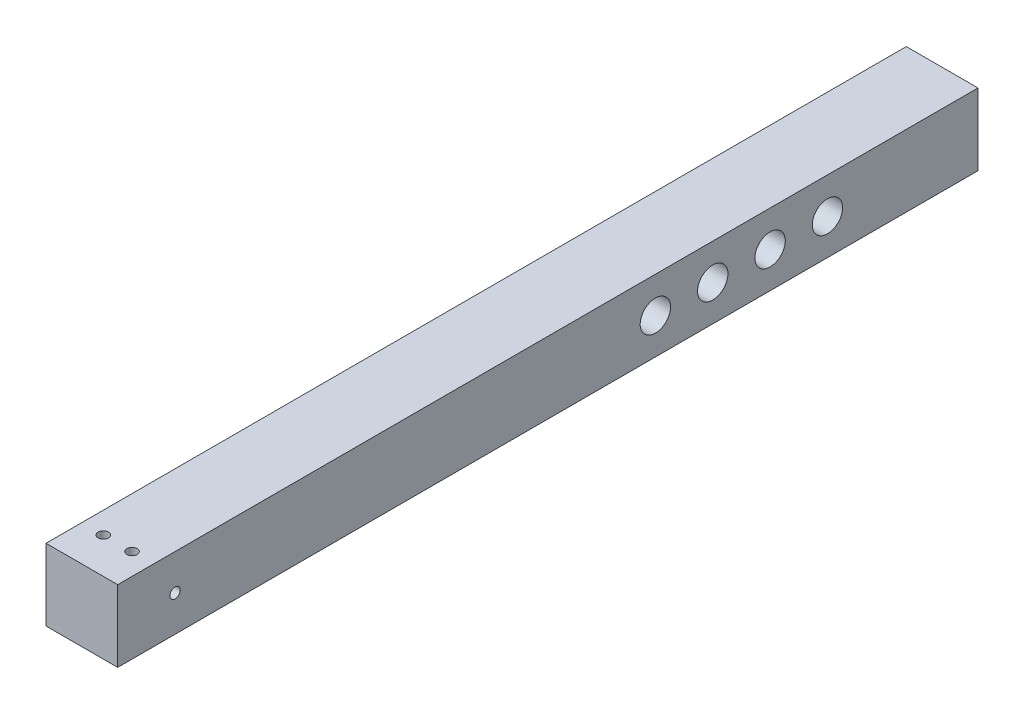
ISO-10303-21;
HEADER;
FILE_DESCRIPTION(('STEP AP214'),'2;1');
FILE_NAME('part.step','',(''),(''),'','','');
FILE_SCHEMA(('AUTOMOTIVE_DESIGN { 1 0 10303 214 1 1 1 1 }'));
ENDSEC;
DATA;
#1=APPLICATION_CONTEXT('core data for automotive mechanical design processes');
#2=APPLICATION_PROTOCOL_DEFINITION('international standard','automotive_design',2000,#1);
#3=PRODUCT_CONTEXT('',#1,'mechanical');
#4=PRODUCT('Part','Part','',(#3));
#5=PRODUCT_RELATED_PRODUCT_CATEGORY('part','',(#4));
#6=PRODUCT_DEFINITION_FORMATION('','',#4);
#7=PRODUCT_DEFINITION_CONTEXT('part definition',#1,'design');
#8=PRODUCT_DEFINITION('design','',#6,#7);
#9=PRODUCT_DEFINITION_SHAPE('','',#8);
#10=(LENGTH_UNIT() NAMED_UNIT(*) SI_UNIT(.MILLI.,.METRE.));
#11=(NAMED_UNIT(*) PLANE_ANGLE_UNIT() SI_UNIT($,.RADIAN.));
#12=(NAMED_UNIT(*) SI_UNIT($,.STERADIAN.) SOLID_ANGLE_UNIT());
#13=UNCERTAINTY_MEASURE_WITH_UNIT(LENGTH_MEASURE(1.E-05),#10,'distance_accuracy_value','');
#14=(GEOMETRIC_REPRESENTATION_CONTEXT(3) GLOBAL_UNCERTAINTY_ASSIGNED_CONTEXT((#13)) GLOBAL_UNIT_ASSIGNED_CONTEXT((#10,
#11,#12)) REPRESENTATION_CONTEXT('',''));
#15=CARTESIAN_POINT('',(0.,0.,0.));
#16=DIRECTION('',(0.,0.,1.));
#17=DIRECTION('',(1.,0.,0.));
#18=AXIS2_PLACEMENT_3D('',#15,#16,#17);
#19=CARTESIAN_POINT('',(12.5,12.5,200.));
#20=DIRECTION('',(-1.,0.,0.));
#21=DIRECTION('',(0.,-1.,0.));
#22=AXIS2_PLACEMENT_3D('',#19,#20,#21);
#23=PLANE('',#22);
#24=CARTESIAN_POINT('',(12.5,8.37955521322352E-13,-47.5));
#25=DIRECTION('',(-1.,0.,0.));
#26=DIRECTION('',(0.,-1.,0.));
#27=AXIS2_PLACEMENT_3D('',#24,#25,#26);
#28=CIRCLE('',#27,5.3);
#29=CARTESIAN_POINT('',(12.5,-5.29999999999916,-47.5));
#30=VERTEX_POINT('',#29);
#31=EDGE_CURVE('E134',#30,#30,#28,.T.);
#32=ORIENTED_EDGE('',*,*,#31,.T.);
#33=EDGE_LOOP('',(#32));
#34=FACE_BOUND('',#33,.T.);
#35=CARTESIAN_POINT('',(12.5,8.37955521322352E-13,-27.5));
#36=DIRECTION('',(-1.,0.,0.));
#37=DIRECTION('',(0.,-1.,0.));
#38=AXIS2_PLACEMENT_3D('',#35,#36,#37);
#39=CIRCLE('',#38,5.3);
#40=CARTESIAN_POINT('',(12.5,-5.29999999999916,-27.5));
#41=VERTEX_POINT('',#40);
#42=EDGE_CURVE('E187',#41,#41,#39,.T.);
#43=ORIENTED_EDGE('',*,*,#42,.T.);
#44=EDGE_LOOP('',(#43));
#45=FACE_BOUND('',#44,.T.);
#46=CARTESIAN_POINT('',(12.5,8.37955521322352E-13,-7.49999999999999));
#47=DIRECTION('',(-1.,0.,0.));
#48=DIRECTION('',(0.,-1.,0.));
#49=AXIS2_PLACEMENT_3D('',#46,#47,#48);
#50=CIRCLE('',#49,5.3);
#51=CARTESIAN_POINT('',(12.5,-5.29999999999916,-7.49999999999999));
#52=VERTEX_POINT('',#51);
#53=EDGE_CURVE('E191',#52,#52,#50,.T.);
#54=ORIENTED_EDGE('',*,*,#53,.T.);
#55=EDGE_LOOP('',(#54));
#56=FACE_BOUND('',#55,.T.);
#57=CARTESIAN_POINT('',(12.5,8.37955521322352E-13,12.5));
#58=DIRECTION('',(-1.,0.,0.));
#59=DIRECTION('',(0.,-1.,0.));
#60=AXIS2_PLACEMENT_3D('',#57,#58,#59);
#61=CIRCLE('',#60,5.3);
#62=CARTESIAN_POINT('',(12.5,-5.29999999999916,12.5));
#63=VERTEX_POINT('',#62);
#64=EDGE_CURVE('E147',#63,#63,#61,.T.);
#65=ORIENTED_EDGE('',*,*,#64,.T.);
#66=EDGE_LOOP('',(#65));
#67=FACE_BOUND('',#66,.T.);
#68=DIRECTION('',(0.,0.,-1.));
#69=VECTOR('',#68,1.);
#70=CARTESIAN_POINT('',(12.5,-12.5,200.));
#71=LINE('',#70,#69);
#72=CARTESIAN_POINT('',(12.5,-12.5,200.));
#73=VERTEX_POINT('',#72);
#74=CARTESIAN_POINT('',(12.5,-12.5,-100.));
#75=VERTEX_POINT('',#74);
#76=EDGE_CURVE('E100',#73,#75,#71,.T.);
#77=ORIENTED_EDGE('',*,*,#76,.T.);
#78=DIRECTION('',(0.,1.,0.));
#79=VECTOR('',#78,1.);
#80=CARTESIAN_POINT('',(12.5,-12.5,-100.));
#81=LINE('',#80,#79);
#82=CARTESIAN_POINT('',(12.5,12.5,-100.));
#83=VERTEX_POINT('',#82);
#84=EDGE_CURVE('E61',#75,#83,#81,.T.);
#85=ORIENTED_EDGE('',*,*,#84,.T.);
#86=DIRECTION('',(0.,0.,-1.));
#87=VECTOR('',#86,1.);
#88=CARTESIAN_POINT('',(12.5,12.5,200.));
#89=LINE('',#88,#87);
#90=CARTESIAN_POINT('',(12.5,12.5,200.));
#91=VERTEX_POINT('',#90);
#92=EDGE_CURVE('E11',#91,#83,#89,.T.);
#93=ORIENTED_EDGE('',*,*,#92,.F.);
#94=DIRECTION('',(0.,1.,0.));
#95=VECTOR('',#94,1.);
#96=CARTESIAN_POINT('',(12.5,12.5,200.));
#97=LINE('',#96,#95);
#98=EDGE_CURVE('E107',#73,#91,#97,.T.);
#99=ORIENTED_EDGE('',*,*,#98,.F.);
#100=EDGE_LOOP('',(#77,#85,#93,#99));
#101=FACE_BOUND('',#100,.T.);
#102=CARTESIAN_POINT('',(12.5,0.,180.));
#103=DIRECTION('',(-1.,0.,0.));
#104=DIRECTION('',(0.,-1.,0.));
#105=AXIS2_PLACEMENT_3D('',#102,#103,#104);
#106=CIRCLE('',#105,1.80000000000001);
#107=CARTESIAN_POINT('',(12.5,-1.8,180.));
#108=VERTEX_POINT('',#107);
#109=EDGE_CURVE('E129',#108,#108,#106,.T.);
#110=ORIENTED_EDGE('',*,*,#109,.T.);
#111=EDGE_LOOP('',(#110));
#112=FACE_BOUND('',#111,.T.);
#113=ADVANCED_FACE('F45',(#34,#45,#56,#67,#101,#112),#23,.F.);
#114=CARTESIAN_POINT('',(-12.5,12.5,200.));
#115=DIRECTION('',(0.,-1.,0.));
#116=DIRECTION('',(0.,0.,-1.));
#117=AXIS2_PLACEMENT_3D('',#114,#115,#116);
#118=PLANE('',#117);
#119=ORIENTED_EDGE('',*,*,#92,.T.);
#120=DIRECTION('',(-1.,0.,0.));
#121=VECTOR('',#120,1.);
#122=CARTESIAN_POINT('',(12.5,12.5,-100.));
#123=LINE('',#122,#121);
#124=CARTESIAN_POINT('',(-12.5,12.5,-100.));
#125=VERTEX_POINT('',#124);
#126=EDGE_CURVE('E86',#83,#125,#123,.T.);
#127=ORIENTED_EDGE('',*,*,#126,.T.);
#128=DIRECTION('',(0.,0.,-1.));
#129=VECTOR('',#128,1.);
#130=CARTESIAN_POINT('',(-12.5,12.5,200.));
#131=LINE('',#130,#129);
#132=CARTESIAN_POINT('',(-12.5,12.5,200.));
#133=VERTEX_POINT('',#132);
#134=EDGE_CURVE('E53',#133,#125,#131,.T.);
#135=ORIENTED_EDGE('',*,*,#134,.F.);
#136=DIRECTION('',(-1.,0.,0.));
#137=VECTOR('',#136,1.);
#138=CARTESIAN_POINT('',(-12.5,12.5,200.));
#139=LINE('',#138,#137);
#140=EDGE_CURVE('E104',#91,#133,#139,.T.);
#141=ORIENTED_EDGE('',*,*,#140,.F.);
#142=EDGE_LOOP('',(#119,#127,#135,#141));
#143=FACE_BOUND('',#142,.T.);
#144=CARTESIAN_POINT('',(5.,12.5,187.5));
#145=DIRECTION('',(0.,1.,0.));
#146=DIRECTION('',(0.,0.,1.));
#147=AXIS2_PLACEMENT_3D('',#144,#145,#146);
#148=CIRCLE('',#147,1.8);
#149=CARTESIAN_POINT('',(5.,12.5,189.3));
#150=VERTEX_POINT('',#149);
#151=EDGE_CURVE('E151',#150,#150,#148,.T.);
#152=ORIENTED_EDGE('',*,*,#151,.F.);
#153=EDGE_LOOP('',(#152));
#154=FACE_BOUND('',#153,.T.);
#155=CARTESIAN_POINT('',(-5.,12.5,187.5));
#156=DIRECTION('',(0.,1.,0.));
#157=DIRECTION('',(0.,0.,1.));
#158=AXIS2_PLACEMENT_3D('',#155,#156,#157);
#159=CIRCLE('',#158,1.8);
#160=CARTESIAN_POINT('',(-5.,12.5,189.3));
#161=VERTEX_POINT('',#160);
#162=EDGE_CURVE('E113',#161,#161,#159,.T.);
#163=ORIENTED_EDGE('',*,*,#162,.F.);
#164=EDGE_LOOP('',(#163));
#165=FACE_BOUND('',#164,.T.);
#166=ADVANCED_FACE('F102',(#143,#154,#165),#118,.F.);
#167=CARTESIAN_POINT('',(-12.5,12.5,200.));
#168=DIRECTION('',(1.,0.,0.));
#169=DIRECTION('',(0.,1.,0.));
#170=AXIS2_PLACEMENT_3D('',#167,#168,#169);
#171=PLANE('',#170);
#172=CARTESIAN_POINT('',(-12.5,8.34486074370399E-13,-47.5));
#173=DIRECTION('',(1.,0.,0.));
#174=DIRECTION('',(0.,1.,0.));
#175=AXIS2_PLACEMENT_3D('',#172,#173,#174);
#176=CIRCLE('',#175,5.3);
#177=CARTESIAN_POINT('',(-12.5,-5.29999999999917,-47.5));
#178=VERTEX_POINT('',#177);
#179=EDGE_CURVE('E48',#178,#178,#176,.T.);
#180=ORIENTED_EDGE('',*,*,#179,.T.);
#181=EDGE_LOOP('',(#180));
#182=FACE_BOUND('',#181,.T.);
#183=CARTESIAN_POINT('',(-12.5,8.34486074370399E-13,-27.5));
#184=DIRECTION('',(1.,0.,0.));
#185=DIRECTION('',(0.,1.,0.));
#186=AXIS2_PLACEMENT_3D('',#183,#184,#185);
#187=CIRCLE('',#186,5.3);
#188=CARTESIAN_POINT('',(-12.5,-5.29999999999916,-27.5));
#189=VERTEX_POINT('',#188);
#190=EDGE_CURVE('E136',#189,#189,#187,.T.);
#191=ORIENTED_EDGE('',*,*,#190,.T.);
#192=EDGE_LOOP('',(#191));
#193=FACE_BOUND('',#192,.T.);
#194=CARTESIAN_POINT('',(-12.5,8.34486074370399E-13,-7.49999999999999));
#195=DIRECTION('',(1.,0.,0.));
#196=DIRECTION('',(0.,1.,0.));
#197=AXIS2_PLACEMENT_3D('',#194,#195,#196);
#198=CIRCLE('',#197,5.3);
#199=CARTESIAN_POINT('',(-12.5,-5.29999999999917,-7.49999999999999));
#200=VERTEX_POINT('',#199);
#201=EDGE_CURVE('E133',#200,#200,#198,.T.);
#202=ORIENTED_EDGE('',*,*,#201,.T.);
#203=EDGE_LOOP('',(#202));
#204=FACE_BOUND('',#203,.T.);
#205=CARTESIAN_POINT('',(-12.5,8.34486074370399E-13,12.5));
#206=DIRECTION('',(1.,0.,0.));
#207=DIRECTION('',(0.,1.,0.));
#208=AXIS2_PLACEMENT_3D('',#205,#206,#207);
#209=CIRCLE('',#208,5.3);
#210=CARTESIAN_POINT('',(-12.5,-5.29999999999917,12.5));
#211=VERTEX_POINT('',#210);
#212=EDGE_CURVE('E130',#211,#211,#209,.T.);
#213=ORIENTED_EDGE('',*,*,#212,.T.);
#214=EDGE_LOOP('',(#213));
#215=FACE_BOUND('',#214,.T.);
#216=ORIENTED_EDGE('',*,*,#134,.T.);
#217=DIRECTION('',(0.,-1.,0.));
#218=VECTOR('',#217,1.);
#219=CARTESIAN_POINT('',(-12.5,12.5,-100.));
#220=LINE('',#219,#218);
#221=CARTESIAN_POINT('',(-12.5,-12.5,-100.));
#222=VERTEX_POINT('',#221);
#223=EDGE_CURVE('E89',#125,#222,#220,.T.);
#224=ORIENTED_EDGE('',*,*,#223,.T.);
#225=DIRECTION('',(0.,0.,-1.));
#226=VECTOR('',#225,1.);
#227=CARTESIAN_POINT('',(-12.5,-12.5,200.));
#228=LINE('',#227,#226);
#229=CARTESIAN_POINT('',(-12.5,-12.5,200.));
#230=VERTEX_POINT('',#229);
#231=EDGE_CURVE('E122',#230,#222,#228,.T.);
#232=ORIENTED_EDGE('',*,*,#231,.F.);
#233=DIRECTION('',(0.,-1.,0.));
#234=VECTOR('',#233,1.);
#235=CARTESIAN_POINT('',(-12.5,12.5,200.));
#236=LINE('',#235,#234);
#237=EDGE_CURVE('E106',#133,#230,#236,.T.);
#238=ORIENTED_EDGE('',*,*,#237,.F.);
#239=EDGE_LOOP('',(#216,#224,#232,#238));
#240=FACE_BOUND('',#239,.T.);
#241=CARTESIAN_POINT('',(-12.5,0.,180.));
#242=DIRECTION('',(1.,0.,0.));
#243=DIRECTION('',(0.,1.,0.));
#244=AXIS2_PLACEMENT_3D('',#241,#242,#243);
#245=CIRCLE('',#244,1.80000000000001);
#246=CARTESIAN_POINT('',(-12.5,1.80000000000001,180.));
#247=VERTEX_POINT('',#246);
#248=EDGE_CURVE('E126',#247,#247,#245,.T.);
#249=ORIENTED_EDGE('',*,*,#248,.T.);
#250=EDGE_LOOP('',(#249));
#251=FACE_BOUND('',#250,.T.);
#252=ADVANCED_FACE('F180',(#182,#193,#204,#215,#240,#251),#171,.F.);
#253=CARTESIAN_POINT('',(-12.5,-12.5,200.));
#254=DIRECTION('',(0.,1.,0.));
#255=DIRECTION('',(0.,0.,1.));
#256=AXIS2_PLACEMENT_3D('',#253,#254,#255);
#257=PLANE('',#256);
#258=ORIENTED_EDGE('',*,*,#231,.T.);
#259=DIRECTION('',(-1.,0.,0.));
#260=VECTOR('',#259,1.);
#261=CARTESIAN_POINT('',(12.5,-12.5,-100.));
#262=LINE('',#261,#260);
#263=EDGE_CURVE('E93',#75,#222,#262,.T.);
#264=ORIENTED_EDGE('',*,*,#263,.F.);
#265=ORIENTED_EDGE('',*,*,#76,.F.);
#266=DIRECTION('',(1.,0.,0.));
#267=VECTOR('',#266,1.);
#268=CARTESIAN_POINT('',(-12.5,-12.5,200.));
#269=LINE('',#268,#267);
#270=EDGE_CURVE('E69',#230,#73,#269,.T.);
#271=ORIENTED_EDGE('',*,*,#270,.F.);
#272=EDGE_LOOP('',(#258,#264,#265,#271));
#273=FACE_BOUND('',#272,.T.);
#274=CARTESIAN_POINT('',(5.,-12.5,187.5));
#275=DIRECTION('',(0.,1.,0.));
#276=DIRECTION('',(0.,0.,1.));
#277=AXIS2_PLACEMENT_3D('',#274,#275,#276);
#278=CIRCLE('',#277,1.8);
#279=CARTESIAN_POINT('',(5.,-12.5,189.3));
#280=VERTEX_POINT('',#279);
#281=EDGE_CURVE('E116',#280,#280,#278,.T.);
#282=ORIENTED_EDGE('',*,*,#281,.T.);
#283=EDGE_LOOP('',(#282));
#284=FACE_BOUND('',#283,.T.);
#285=CARTESIAN_POINT('',(-5.,-12.5,187.5));
#286=DIRECTION('',(0.,1.,0.));
#287=DIRECTION('',(0.,0.,1.));
#288=AXIS2_PLACEMENT_3D('',#285,#286,#287);
#289=CIRCLE('',#288,1.8);
#290=CARTESIAN_POINT('',(-5.,-12.5,189.3));
#291=VERTEX_POINT('',#290);
#292=EDGE_CURVE('E110',#291,#291,#289,.T.);
#293=ORIENTED_EDGE('',*,*,#292,.T.);
#294=EDGE_LOOP('',(#293));
#295=FACE_BOUND('',#294,.T.);
#296=ADVANCED_FACE('F158',(#273,#284,#295),#257,.F.);
#297=CARTESIAN_POINT('',(0.,0.,200.));
#298=DIRECTION('',(0.,0.,1.));
#299=DIRECTION('',(1.,0.,0.));
#300=AXIS2_PLACEMENT_3D('',#297,#298,#299);
#301=PLANE('',#300);
#302=ORIENTED_EDGE('',*,*,#98,.T.);
#303=ORIENTED_EDGE('',*,*,#140,.T.);
#304=ORIENTED_EDGE('',*,*,#237,.T.);
#305=ORIENTED_EDGE('',*,*,#270,.T.);
#306=EDGE_LOOP('',(#302,#303,#304,#305));
#307=FACE_BOUND('',#306,.T.);
#308=ADVANCED_FACE('F109',(#307),#301,.T.);
#309=CARTESIAN_POINT('',(5.,-12.5,187.5));
#310=DIRECTION('',(0.,1.,0.));
#311=DIRECTION('',(0.,0.,1.));
#312=AXIS2_PLACEMENT_3D('',#309,#310,#311);
#313=CYLINDRICAL_SURFACE('',#312,1.8);
#314=ORIENTED_EDGE('',*,*,#281,.F.);
#315=EDGE_LOOP('',(#314));
#316=FACE_BOUND('',#315,.T.);
#317=ORIENTED_EDGE('',*,*,#151,.T.);
#318=EDGE_LOOP('',(#317));
#319=FACE_BOUND('',#318,.T.);
#320=ADVANCED_FACE('F161',(#316,#319),#313,.F.);
#321=CARTESIAN_POINT('',(-5.,-12.5,187.5));
#322=DIRECTION('',(0.,1.,0.));
#323=DIRECTION('',(0.,0.,1.));
#324=AXIS2_PLACEMENT_3D('',#321,#322,#323);
#325=CYLINDRICAL_SURFACE('',#324,1.8);
#326=ORIENTED_EDGE('',*,*,#292,.F.);
#327=EDGE_LOOP('',(#326));
#328=FACE_BOUND('',#327,.T.);
#329=ORIENTED_EDGE('',*,*,#162,.T.);
#330=EDGE_LOOP('',(#329));
#331=FACE_BOUND('',#330,.T.);
#332=ADVANCED_FACE('F163',(#328,#331),#325,.F.);
#333=CARTESIAN_POINT('',(12.5,0.,180.));
#334=DIRECTION('',(-1.,0.,0.));
#335=DIRECTION('',(0.,-1.,0.));
#336=AXIS2_PLACEMENT_3D('',#333,#334,#335);
#337=CYLINDRICAL_SURFACE('',#336,1.80000000000001);
#338=ORIENTED_EDGE('',*,*,#109,.F.);
#339=EDGE_LOOP('',(#338));
#340=FACE_BOUND('',#339,.T.);
#341=ORIENTED_EDGE('',*,*,#248,.F.);
#342=EDGE_LOOP('',(#341));
#343=FACE_BOUND('',#342,.T.);
#344=ADVANCED_FACE('F169',(#340,#343),#337,.F.);
#345=CARTESIAN_POINT('',(12.5,8.37955521322352E-13,12.5));
#346=DIRECTION('',(-1.,0.,0.));
#347=DIRECTION('',(0.,-1.,0.));
#348=AXIS2_PLACEMENT_3D('',#345,#346,#347);
#349=CYLINDRICAL_SURFACE('',#348,5.3);
#350=CARTESIAN_POINT('',(12.5,-5.29999999999916,12.5));
#351=CARTESIAN_POINT('',(12.2395833333333,-5.29999999999916,12.5));
#352=CARTESIAN_POINT('',(11.9791666666667,-5.29999999999916,12.5));
#353=CARTESIAN_POINT('',(11.4583333333333,-5.29999999999916,12.5));
#354=CARTESIAN_POINT('',(11.1979166666667,-5.29999999999916,12.5));
#355=CARTESIAN_POINT('',(10.6770833333333,-5.29999999999916,12.5));
#356=CARTESIAN_POINT('',(10.4166666666667,-5.29999999999916,12.5));
#357=CARTESIAN_POINT('',(9.89583333333334,-5.29999999999916,12.5));
#358=CARTESIAN_POINT('',(9.63541666666668,-5.29999999999916,12.5));
#359=CARTESIAN_POINT('',(9.11458333333334,-5.29999999999916,12.5));
#360=CARTESIAN_POINT('',(8.85416666666668,-5.29999999999916,12.5));
#361=CARTESIAN_POINT('',(8.33333333333334,-5.29999999999916,12.5));
#362=CARTESIAN_POINT('',(8.07291666666668,-5.29999999999916,12.5));
#363=CARTESIAN_POINT('',(7.55208333333334,-5.29999999999916,12.5));
#364=CARTESIAN_POINT('',(7.29166666666668,-5.29999999999916,12.5));
#365=CARTESIAN_POINT('',(6.77083333333334,-5.29999999999916,12.5));
#366=CARTESIAN_POINT('',(6.51041666666668,-5.29999999999916,12.5));
#367=CARTESIAN_POINT('',(5.98958333333334,-5.29999999999916,12.5));
#368=CARTESIAN_POINT('',(5.72916666666667,-5.29999999999916,12.5));
#369=CARTESIAN_POINT('',(5.20833333333334,-5.29999999999916,12.5));
#370=CARTESIAN_POINT('',(4.94791666666668,-5.29999999999916,12.5));
#371=CARTESIAN_POINT('',(4.42708333333334,-5.29999999999916,12.5));
#372=CARTESIAN_POINT('',(4.16666666666667,-5.29999999999916,12.5));
#373=CARTESIAN_POINT('',(3.64583333333334,-5.29999999999916,12.5));
#374=CARTESIAN_POINT('',(3.38541666666668,-5.29999999999916,12.5));
#375=CARTESIAN_POINT('',(2.86458333333334,-5.29999999999916,12.5));
#376=CARTESIAN_POINT('',(2.60416666666668,-5.29999999999916,12.5));
#377=CARTESIAN_POINT('',(2.08333333333334,-5.29999999999916,12.5));
#378=CARTESIAN_POINT('',(1.82291666666668,-5.29999999999916,12.5));
#379=CARTESIAN_POINT('',(1.30208333333334,-5.29999999999916,12.5));
#380=CARTESIAN_POINT('',(1.04166666666667,-5.29999999999916,12.5));
#381=CARTESIAN_POINT('',(0.520833333333341,-5.29999999999916,12.5));
#382=CARTESIAN_POINT('',(0.260416666666674,-5.29999999999916,12.5));
#383=CARTESIAN_POINT('',(-0.26041666666666,-5.29999999999916,12.5));
#384=CARTESIAN_POINT('',(-0.520833333333327,-5.29999999999916,12.5));
#385=CARTESIAN_POINT('',(-1.04166666666666,-5.29999999999916,12.5));
#386=CARTESIAN_POINT('',(-1.30208333333333,-5.29999999999916,12.5));
#387=CARTESIAN_POINT('',(-1.82291666666666,-5.29999999999916,12.5));
#388=CARTESIAN_POINT('',(-2.08333333333333,-5.29999999999916,12.5));
#389=CARTESIAN_POINT('',(-2.60416666666666,-5.29999999999916,12.5));
#390=CARTESIAN_POINT('',(-2.86458333333333,-5.29999999999916,12.5));
#391=CARTESIAN_POINT('',(-3.38541666666666,-5.29999999999916,12.5));
#392=CARTESIAN_POINT('',(-3.64583333333333,-5.29999999999916,12.5));
#393=CARTESIAN_POINT('',(-4.16666666666666,-5.29999999999916,12.5));
#394=CARTESIAN_POINT('',(-4.42708333333333,-5.29999999999916,12.5));
#395=CARTESIAN_POINT('',(-4.94791666666666,-5.29999999999916,12.5));
#396=CARTESIAN_POINT('',(-5.20833333333333,-5.29999999999916,12.5));
#397=CARTESIAN_POINT('',(-5.72916666666666,-5.29999999999916,12.5));
#398=CARTESIAN_POINT('',(-5.98958333333333,-5.29999999999916,12.5));
#399=CARTESIAN_POINT('',(-6.51041666666666,-5.29999999999916,12.5));
#400=CARTESIAN_POINT('',(-6.77083333333333,-5.29999999999916,12.5));
#401=CARTESIAN_POINT('',(-7.29166666666666,-5.29999999999916,12.5));
#402=CARTESIAN_POINT('',(-7.55208333333333,-5.29999999999916,12.5));
#403=CARTESIAN_POINT('',(-8.07291666666666,-5.29999999999916,12.5));
#404=CARTESIAN_POINT('',(-8.33333333333333,-5.29999999999916,12.5));
#405=CARTESIAN_POINT('',(-8.85416666666666,-5.29999999999916,12.5));
#406=CARTESIAN_POINT('',(-9.11458333333333,-5.29999999999917,12.5));
#407=CARTESIAN_POINT('',(-9.63541666666667,-5.29999999999917,12.5));
#408=CARTESIAN_POINT('',(-9.89583333333333,-5.29999999999917,12.5));
#409=CARTESIAN_POINT('',(-10.4166666666667,-5.29999999999917,12.5));
#410=CARTESIAN_POINT('',(-10.6770833333333,-5.29999999999917,12.5));
#411=CARTESIAN_POINT('',(-11.1979166666667,-5.29999999999917,12.5));
#412=CARTESIAN_POINT('',(-11.4583333333333,-5.29999999999917,12.5));
#413=CARTESIAN_POINT('',(-11.9791666666667,-5.29999999999917,12.5));
#414=CARTESIAN_POINT('',(-12.2395833333333,-5.29999999999917,12.5));
#415=CARTESIAN_POINT('',(-12.5,-5.29999999999917,12.5));
#416=B_SPLINE_CURVE_WITH_KNOTS('',3,(#350,#351,#352,#353,#354,#355,#356,#357,#358,#359,#360,
#361,#362,#363,#364,#365,#366,#367,#368,#369,#370,#371,#372,#373,#374,#375,#376,#377,#378,#379,
#380,#381,#382,#383,#384,#385,#386,#387,#388,#389,#390,#391,#392,#393,#394,#395,#396,#397,#398,
#399,#400,#401,#402,#403,#404,#405,#406,#407,#408,#409,#410,#411,#412,#413,#414,#415),
.UNSPECIFIED.,.F.,.F.,(4,2,2,2,2,2,2,2,2,2,2,2,2,2,2,2,2,2,2,2,2,2,2,2,2,2,2,2,2,2,2,2,4),(0.,
0.781250000000001,1.5625,2.34375,3.125,3.90625,4.6875,5.46875,6.25,7.03125,7.8125,8.59375,9.375,
10.15625,10.9375,11.71875,12.5,13.28125,14.0625,14.84375,15.625,16.40625,17.1875,17.96875,18.75,
19.53125,20.3125,21.09375,21.875,22.65625,23.4375,24.21875,25.),.UNSPECIFIED.);
#417=EDGE_CURVE('BSEAM208',#63,#211,#416,.T.);
#418=ORIENTED_EDGE('',*,*,#64,.F.);
#419=ORIENTED_EDGE('',*,*,#212,.F.);
#420=ORIENTED_EDGE('',*,*,#417,.T.);
#421=ORIENTED_EDGE('',*,*,#417,.F.);
#422=EDGE_LOOP('',(#418,#420,#419,#421));
#423=FACE_BOUND('',#422,.T.);
#424=ADVANCED_FACE('F208',(#423),#349,.F.);
#425=CARTESIAN_POINT('',(12.5,8.37955521322352E-13,-7.49999999999999));
#426=DIRECTION('',(-1.,0.,0.));
#427=DIRECTION('',(0.,-1.,0.));
#428=AXIS2_PLACEMENT_3D('',#425,#426,#427);
#429=CYLINDRICAL_SURFACE('',#428,5.3);
#430=CARTESIAN_POINT('',(12.5,-5.29999999999916,-7.49999999999999));
#431=CARTESIAN_POINT('',(12.2395833333333,-5.29999999999916,-7.49999999999999));
#432=CARTESIAN_POINT('',(11.9791666666667,-5.29999999999916,-7.49999999999999));
#433=CARTESIAN_POINT('',(11.4583333333333,-5.29999999999916,-7.49999999999999));
#434=CARTESIAN_POINT('',(11.1979166666667,-5.29999999999916,-7.49999999999999));
#435=CARTESIAN_POINT('',(10.6770833333333,-5.29999999999916,-7.49999999999999));
#436=CARTESIAN_POINT('',(10.4166666666667,-5.29999999999916,-7.49999999999999));
#437=CARTESIAN_POINT('',(9.89583333333334,-5.29999999999916,-7.49999999999999));
#438=CARTESIAN_POINT('',(9.63541666666668,-5.29999999999916,-7.49999999999999));
#439=CARTESIAN_POINT('',(9.11458333333334,-5.29999999999916,-7.49999999999999));
#440=CARTESIAN_POINT('',(8.85416666666668,-5.29999999999916,-7.49999999999999));
#441=CARTESIAN_POINT('',(8.33333333333334,-5.29999999999916,-7.49999999999999));
#442=CARTESIAN_POINT('',(8.07291666666668,-5.29999999999916,-7.49999999999999));
#443=CARTESIAN_POINT('',(7.55208333333334,-5.29999999999916,-7.49999999999999));
#444=CARTESIAN_POINT('',(7.29166666666668,-5.29999999999916,-7.49999999999999));
#445=CARTESIAN_POINT('',(6.77083333333334,-5.29999999999916,-7.49999999999999));
#446=CARTESIAN_POINT('',(6.51041666666668,-5.29999999999916,-7.49999999999999));
#447=CARTESIAN_POINT('',(5.98958333333334,-5.29999999999916,-7.49999999999999));
#448=CARTESIAN_POINT('',(5.72916666666667,-5.29999999999916,-7.49999999999999));
#449=CARTESIAN_POINT('',(5.20833333333334,-5.29999999999916,-7.49999999999999));
#450=CARTESIAN_POINT('',(4.94791666666668,-5.29999999999916,-7.49999999999999));
#451=CARTESIAN_POINT('',(4.42708333333334,-5.29999999999916,-7.49999999999999));
#452=CARTESIAN_POINT('',(4.16666666666667,-5.29999999999916,-7.49999999999999));
#453=CARTESIAN_POINT('',(3.64583333333334,-5.29999999999916,-7.49999999999999));
#454=CARTESIAN_POINT('',(3.38541666666668,-5.29999999999916,-7.49999999999999));
#455=CARTESIAN_POINT('',(2.86458333333334,-5.29999999999916,-7.49999999999999));
#456=CARTESIAN_POINT('',(2.60416666666668,-5.29999999999916,-7.49999999999999));
#457=CARTESIAN_POINT('',(2.08333333333334,-5.29999999999916,-7.49999999999999));
#458=CARTESIAN_POINT('',(1.82291666666668,-5.29999999999916,-7.49999999999999));
#459=CARTESIAN_POINT('',(1.30208333333334,-5.29999999999916,-7.49999999999999));
#460=CARTESIAN_POINT('',(1.04166666666667,-5.29999999999916,-7.49999999999999));
#461=CARTESIAN_POINT('',(0.520833333333341,-5.29999999999916,-7.49999999999999));
#462=CARTESIAN_POINT('',(0.260416666666674,-5.29999999999916,-7.49999999999999));
#463=CARTESIAN_POINT('',(-0.26041666666666,-5.29999999999916,-7.49999999999999));
#464=CARTESIAN_POINT('',(-0.520833333333327,-5.29999999999916,-7.49999999999999));
#465=CARTESIAN_POINT('',(-1.04166666666666,-5.29999999999916,-7.49999999999999));
#466=CARTESIAN_POINT('',(-1.30208333333333,-5.29999999999916,-7.49999999999999));
#467=CARTESIAN_POINT('',(-1.82291666666666,-5.29999999999916,-7.49999999999999));
#468=CARTESIAN_POINT('',(-2.08333333333333,-5.29999999999916,-7.49999999999999));
#469=CARTESIAN_POINT('',(-2.60416666666666,-5.29999999999916,-7.49999999999999));
#470=CARTESIAN_POINT('',(-2.86458333333333,-5.29999999999916,-7.49999999999999));
#471=CARTESIAN_POINT('',(-3.38541666666666,-5.29999999999916,-7.49999999999999));
#472=CARTESIAN_POINT('',(-3.64583333333333,-5.29999999999916,-7.49999999999999));
#473=CARTESIAN_POINT('',(-4.16666666666666,-5.29999999999916,-7.49999999999999));
#474=CARTESIAN_POINT('',(-4.42708333333333,-5.29999999999916,-7.49999999999999));
#475=CARTESIAN_POINT('',(-4.94791666666666,-5.29999999999916,-7.49999999999999));
#476=CARTESIAN_POINT('',(-5.20833333333333,-5.29999999999916,-7.49999999999999));
#477=CARTESIAN_POINT('',(-5.72916666666666,-5.29999999999916,-7.49999999999999));
#478=CARTESIAN_POINT('',(-5.98958333333333,-5.29999999999916,-7.49999999999999));
#479=CARTESIAN_POINT('',(-6.51041666666666,-5.29999999999916,-7.49999999999999));
#480=CARTESIAN_POINT('',(-6.77083333333333,-5.29999999999916,-7.49999999999999));
#481=CARTESIAN_POINT('',(-7.29166666666666,-5.29999999999916,-7.49999999999999));
#482=CARTESIAN_POINT('',(-7.55208333333333,-5.29999999999916,-7.49999999999999));
#483=CARTESIAN_POINT('',(-8.07291666666666,-5.29999999999916,-7.49999999999999));
#484=CARTESIAN_POINT('',(-8.33333333333333,-5.29999999999916,-7.49999999999999));
#485=CARTESIAN_POINT('',(-8.85416666666666,-5.29999999999916,-7.49999999999999));
#486=CARTESIAN_POINT('',(-9.11458333333333,-5.29999999999917,-7.49999999999999));
#487=CARTESIAN_POINT('',(-9.63541666666667,-5.29999999999917,-7.49999999999999));
#488=CARTESIAN_POINT('',(-9.89583333333333,-5.29999999999917,-7.49999999999999));
#489=CARTESIAN_POINT('',(-10.4166666666667,-5.29999999999917,-7.49999999999999));
#490=CARTESIAN_POINT('',(-10.6770833333333,-5.29999999999917,-7.49999999999999));
#491=CARTESIAN_POINT('',(-11.1979166666667,-5.29999999999917,-7.49999999999999));
#492=CARTESIAN_POINT('',(-11.4583333333333,-5.29999999999917,-7.49999999999999));
#493=CARTESIAN_POINT('',(-11.9791666666667,-5.29999999999917,-7.49999999999999));
#494=CARTESIAN_POINT('',(-12.2395833333333,-5.29999999999917,-7.49999999999999));
#495=CARTESIAN_POINT('',(-12.5,-5.29999999999917,-7.49999999999999));
#496=B_SPLINE_CURVE_WITH_KNOTS('',3,(#430,#431,#432,#433,#434,#435,#436,#437,#438,#439,#440,
#441,#442,#443,#444,#445,#446,#447,#448,#449,#450,#451,#452,#453,#454,#455,#456,#457,#458,#459,
#460,#461,#462,#463,#464,#465,#466,#467,#468,#469,#470,#471,#472,#473,#474,#475,#476,#477,#478,
#479,#480,#481,#482,#483,#484,#485,#486,#487,#488,#489,#490,#491,#492,#493,#494,#495),
.UNSPECIFIED.,.F.,.F.,(4,2,2,2,2,2,2,2,2,2,2,2,2,2,2,2,2,2,2,2,2,2,2,2,2,2,2,2,2,2,2,2,4),(0.,
0.781250000000001,1.5625,2.34375,3.125,3.90625,4.6875,5.46875,6.25,7.03125,7.8125,8.59375,9.375,
10.15625,10.9375,11.71875,12.5,13.28125,14.0625,14.84375,15.625,16.40625,17.1875,17.96875,18.75,
19.53125,20.3125,21.09375,21.875,22.65625,23.4375,24.21875,25.),.UNSPECIFIED.);
#497=EDGE_CURVE('BSEAM214',#52,#200,#496,.T.);
#498=ORIENTED_EDGE('',*,*,#53,.F.);
#499=ORIENTED_EDGE('',*,*,#201,.F.);
#500=ORIENTED_EDGE('',*,*,#497,.T.);
#501=ORIENTED_EDGE('',*,*,#497,.F.);
#502=EDGE_LOOP('',(#498,#500,#499,#501));
#503=FACE_BOUND('',#502,.T.);
#504=ADVANCED_FACE('F214',(#503),#429,.F.);
#505=CARTESIAN_POINT('',(12.5,8.37955521322352E-13,-27.5));
#506=DIRECTION('',(-1.,0.,0.));
#507=DIRECTION('',(0.,-1.,0.));
#508=AXIS2_PLACEMENT_3D('',#505,#506,#507);
#509=CYLINDRICAL_SURFACE('',#508,5.3);
#510=CARTESIAN_POINT('',(12.5,-5.29999999999916,-27.5));
#511=CARTESIAN_POINT('',(12.2395833333333,-5.29999999999916,-27.5));
#512=CARTESIAN_POINT('',(11.9791666666667,-5.29999999999916,-27.5));
#513=CARTESIAN_POINT('',(11.4583333333333,-5.29999999999916,-27.5));
#514=CARTESIAN_POINT('',(11.1979166666667,-5.29999999999916,-27.5));
#515=CARTESIAN_POINT('',(10.6770833333333,-5.29999999999916,-27.5));
#516=CARTESIAN_POINT('',(10.4166666666667,-5.29999999999916,-27.5));
#517=CARTESIAN_POINT('',(9.89583333333334,-5.29999999999916,-27.5));
#518=CARTESIAN_POINT('',(9.63541666666668,-5.29999999999916,-27.5));
#519=CARTESIAN_POINT('',(9.11458333333334,-5.29999999999916,-27.5));
#520=CARTESIAN_POINT('',(8.85416666666668,-5.29999999999916,-27.5));
#521=CARTESIAN_POINT('',(8.33333333333334,-5.29999999999916,-27.5));
#522=CARTESIAN_POINT('',(8.07291666666668,-5.29999999999916,-27.5));
#523=CARTESIAN_POINT('',(7.55208333333334,-5.29999999999916,-27.5));
#524=CARTESIAN_POINT('',(7.29166666666668,-5.29999999999916,-27.5));
#525=CARTESIAN_POINT('',(6.77083333333334,-5.29999999999916,-27.5));
#526=CARTESIAN_POINT('',(6.51041666666668,-5.29999999999916,-27.5));
#527=CARTESIAN_POINT('',(5.98958333333334,-5.29999999999916,-27.5));
#528=CARTESIAN_POINT('',(5.72916666666667,-5.29999999999916,-27.5));
#529=CARTESIAN_POINT('',(5.20833333333334,-5.29999999999916,-27.5));
#530=CARTESIAN_POINT('',(4.94791666666668,-5.29999999999916,-27.5));
#531=CARTESIAN_POINT('',(4.42708333333334,-5.29999999999916,-27.5));
#532=CARTESIAN_POINT('',(4.16666666666667,-5.29999999999916,-27.5));
#533=CARTESIAN_POINT('',(3.64583333333334,-5.29999999999916,-27.5));
#534=CARTESIAN_POINT('',(3.38541666666668,-5.29999999999916,-27.5));
#535=CARTESIAN_POINT('',(2.86458333333334,-5.29999999999916,-27.5));
#536=CARTESIAN_POINT('',(2.60416666666668,-5.29999999999916,-27.5));
#537=CARTESIAN_POINT('',(2.08333333333334,-5.29999999999916,-27.5));
#538=CARTESIAN_POINT('',(1.82291666666668,-5.29999999999916,-27.5));
#539=CARTESIAN_POINT('',(1.30208333333334,-5.29999999999916,-27.5));
#540=CARTESIAN_POINT('',(1.04166666666667,-5.29999999999916,-27.5));
#541=CARTESIAN_POINT('',(0.520833333333341,-5.29999999999916,-27.5));
#542=CARTESIAN_POINT('',(0.260416666666674,-5.29999999999916,-27.5));
#543=CARTESIAN_POINT('',(-0.26041666666666,-5.29999999999916,-27.5));
#544=CARTESIAN_POINT('',(-0.520833333333327,-5.29999999999916,-27.5));
#545=CARTESIAN_POINT('',(-1.04166666666666,-5.29999999999916,-27.5));
#546=CARTESIAN_POINT('',(-1.30208333333333,-5.29999999999916,-27.5));
#547=CARTESIAN_POINT('',(-1.82291666666666,-5.29999999999916,-27.5));
#548=CARTESIAN_POINT('',(-2.08333333333333,-5.29999999999916,-27.5));
#549=CARTESIAN_POINT('',(-2.60416666666666,-5.29999999999916,-27.5));
#550=CARTESIAN_POINT('',(-2.86458333333333,-5.29999999999916,-27.5));
#551=CARTESIAN_POINT('',(-3.38541666666666,-5.29999999999916,-27.5));
#552=CARTESIAN_POINT('',(-3.64583333333333,-5.29999999999916,-27.5));
#553=CARTESIAN_POINT('',(-4.16666666666666,-5.29999999999916,-27.5));
#554=CARTESIAN_POINT('',(-4.42708333333333,-5.29999999999916,-27.5));
#555=CARTESIAN_POINT('',(-4.94791666666666,-5.29999999999916,-27.5));
#556=CARTESIAN_POINT('',(-5.20833333333333,-5.29999999999916,-27.5));
#557=CARTESIAN_POINT('',(-5.72916666666666,-5.29999999999916,-27.5));
#558=CARTESIAN_POINT('',(-5.98958333333333,-5.29999999999916,-27.5));
#559=CARTESIAN_POINT('',(-6.51041666666666,-5.29999999999916,-27.5));
#560=CARTESIAN_POINT('',(-6.77083333333333,-5.29999999999916,-27.5));
#561=CARTESIAN_POINT('',(-7.29166666666666,-5.29999999999916,-27.5));
#562=CARTESIAN_POINT('',(-7.55208333333333,-5.29999999999916,-27.5));
#563=CARTESIAN_POINT('',(-8.07291666666666,-5.29999999999916,-27.5));
#564=CARTESIAN_POINT('',(-8.33333333333333,-5.29999999999916,-27.5));
#565=CARTESIAN_POINT('',(-8.85416666666666,-5.29999999999916,-27.5));
#566=CARTESIAN_POINT('',(-9.11458333333333,-5.29999999999916,-27.5));
#567=CARTESIAN_POINT('',(-9.63541666666667,-5.29999999999916,-27.5));
#568=CARTESIAN_POINT('',(-9.89583333333333,-5.29999999999916,-27.5));
#569=CARTESIAN_POINT('',(-10.4166666666667,-5.29999999999916,-27.5));
#570=CARTESIAN_POINT('',(-10.6770833333333,-5.29999999999916,-27.5));
#571=CARTESIAN_POINT('',(-11.1979166666667,-5.29999999999916,-27.5));
#572=CARTESIAN_POINT('',(-11.4583333333333,-5.29999999999916,-27.5));
#573=CARTESIAN_POINT('',(-11.9791666666667,-5.29999999999916,-27.5));
#574=CARTESIAN_POINT('',(-12.2395833333333,-5.29999999999916,-27.5));
#575=CARTESIAN_POINT('',(-12.5,-5.29999999999916,-27.5));
#576=B_SPLINE_CURVE_WITH_KNOTS('',3,(#510,#511,#512,#513,#514,#515,#516,#517,#518,#519,#520,
#521,#522,#523,#524,#525,#526,#527,#528,#529,#530,#531,#532,#533,#534,#535,#536,#537,#538,#539,
#540,#541,#542,#543,#544,#545,#546,#547,#548,#549,#550,#551,#552,#553,#554,#555,#556,#557,#558,
#559,#560,#561,#562,#563,#564,#565,#566,#567,#568,#569,#570,#571,#572,#573,#574,#575),
.UNSPECIFIED.,.F.,.F.,(4,2,2,2,2,2,2,2,2,2,2,2,2,2,2,2,2,2,2,2,2,2,2,2,2,2,2,2,2,2,2,2,4),(0.,
0.781250000000001,1.5625,2.34375,3.125,3.90625,4.6875,5.46875,6.25,7.03125,7.8125,8.59375,9.375,
10.15625,10.9375,11.71875,12.5,13.28125,14.0625,14.84375,15.625,16.40625,17.1875,17.96875,18.75,
19.53125,20.3125,21.09375,21.875,22.65625,23.4375,24.21875,25.),.UNSPECIFIED.);
#577=EDGE_CURVE('BSEAM219',#41,#189,#576,.T.);
#578=ORIENTED_EDGE('',*,*,#42,.F.);
#579=ORIENTED_EDGE('',*,*,#190,.F.);
#580=ORIENTED_EDGE('',*,*,#577,.T.);
#581=ORIENTED_EDGE('',*,*,#577,.F.);
#582=EDGE_LOOP('',(#578,#580,#579,#581));
#583=FACE_BOUND('',#582,.T.);
#584=ADVANCED_FACE('F219',(#583),#509,.F.);
#585=CARTESIAN_POINT('',(12.5,8.37955521322352E-13,-47.5));
#586=DIRECTION('',(-1.,0.,0.));
#587=DIRECTION('',(0.,-1.,0.));
#588=AXIS2_PLACEMENT_3D('',#585,#586,#587);
#589=CYLINDRICAL_SURFACE('',#588,5.3);
#590=CARTESIAN_POINT('',(12.5,-5.29999999999916,-47.5));
#591=CARTESIAN_POINT('',(12.2395833333333,-5.29999999999916,-47.5));
#592=CARTESIAN_POINT('',(11.9791666666667,-5.29999999999916,-47.5));
#593=CARTESIAN_POINT('',(11.4583333333333,-5.29999999999916,-47.5));
#594=CARTESIAN_POINT('',(11.1979166666667,-5.29999999999916,-47.5));
#595=CARTESIAN_POINT('',(10.6770833333333,-5.29999999999916,-47.5));
#596=CARTESIAN_POINT('',(10.4166666666667,-5.29999999999916,-47.5));
#597=CARTESIAN_POINT('',(9.89583333333334,-5.29999999999916,-47.5));
#598=CARTESIAN_POINT('',(9.63541666666668,-5.29999999999916,-47.5));
#599=CARTESIAN_POINT('',(9.11458333333334,-5.29999999999916,-47.5));
#600=CARTESIAN_POINT('',(8.85416666666668,-5.29999999999916,-47.5));
#601=CARTESIAN_POINT('',(8.33333333333334,-5.29999999999916,-47.5));
#602=CARTESIAN_POINT('',(8.07291666666668,-5.29999999999916,-47.5));
#603=CARTESIAN_POINT('',(7.55208333333334,-5.29999999999916,-47.5));
#604=CARTESIAN_POINT('',(7.29166666666668,-5.29999999999916,-47.5));
#605=CARTESIAN_POINT('',(6.77083333333334,-5.29999999999916,-47.5));
#606=CARTESIAN_POINT('',(6.51041666666668,-5.29999999999916,-47.5));
#607=CARTESIAN_POINT('',(5.98958333333334,-5.29999999999916,-47.5));
#608=CARTESIAN_POINT('',(5.72916666666667,-5.29999999999916,-47.5));
#609=CARTESIAN_POINT('',(5.20833333333334,-5.29999999999916,-47.5));
#610=CARTESIAN_POINT('',(4.94791666666668,-5.29999999999916,-47.5));
#611=CARTESIAN_POINT('',(4.42708333333334,-5.29999999999916,-47.5));
#612=CARTESIAN_POINT('',(4.16666666666667,-5.29999999999916,-47.5));
#613=CARTESIAN_POINT('',(3.64583333333334,-5.29999999999916,-47.5));
#614=CARTESIAN_POINT('',(3.38541666666668,-5.29999999999916,-47.5));
#615=CARTESIAN_POINT('',(2.86458333333334,-5.29999999999916,-47.5));
#616=CARTESIAN_POINT('',(2.60416666666668,-5.29999999999916,-47.5));
#617=CARTESIAN_POINT('',(2.08333333333334,-5.29999999999916,-47.5));
#618=CARTESIAN_POINT('',(1.82291666666668,-5.29999999999916,-47.5));
#619=CARTESIAN_POINT('',(1.30208333333334,-5.29999999999916,-47.5));
#620=CARTESIAN_POINT('',(1.04166666666667,-5.29999999999916,-47.5));
#621=CARTESIAN_POINT('',(0.520833333333341,-5.29999999999916,-47.5));
#622=CARTESIAN_POINT('',(0.260416666666674,-5.29999999999916,-47.5));
#623=CARTESIAN_POINT('',(-0.26041666666666,-5.29999999999916,-47.5));
#624=CARTESIAN_POINT('',(-0.520833333333327,-5.29999999999916,-47.5));
#625=CARTESIAN_POINT('',(-1.04166666666666,-5.29999999999916,-47.5));
#626=CARTESIAN_POINT('',(-1.30208333333333,-5.29999999999916,-47.5));
#627=CARTESIAN_POINT('',(-1.82291666666666,-5.29999999999916,-47.5));
#628=CARTESIAN_POINT('',(-2.08333333333333,-5.29999999999916,-47.5));
#629=CARTESIAN_POINT('',(-2.60416666666666,-5.29999999999916,-47.5));
#630=CARTESIAN_POINT('',(-2.86458333333333,-5.29999999999916,-47.5));
#631=CARTESIAN_POINT('',(-3.38541666666666,-5.29999999999916,-47.5));
#632=CARTESIAN_POINT('',(-3.64583333333333,-5.29999999999916,-47.5));
#633=CARTESIAN_POINT('',(-4.16666666666666,-5.29999999999916,-47.5));
#634=CARTESIAN_POINT('',(-4.42708333333333,-5.29999999999916,-47.5));
#635=CARTESIAN_POINT('',(-4.94791666666666,-5.29999999999916,-47.5));
#636=CARTESIAN_POINT('',(-5.20833333333333,-5.29999999999916,-47.5));
#637=CARTESIAN_POINT('',(-5.72916666666666,-5.29999999999916,-47.5));
#638=CARTESIAN_POINT('',(-5.98958333333333,-5.29999999999916,-47.5));
#639=CARTESIAN_POINT('',(-6.51041666666666,-5.29999999999916,-47.5));
#640=CARTESIAN_POINT('',(-6.77083333333333,-5.29999999999916,-47.5));
#641=CARTESIAN_POINT('',(-7.29166666666666,-5.29999999999916,-47.5));
#642=CARTESIAN_POINT('',(-7.55208333333333,-5.29999999999916,-47.5));
#643=CARTESIAN_POINT('',(-8.07291666666666,-5.29999999999916,-47.5));
#644=CARTESIAN_POINT('',(-8.33333333333333,-5.29999999999916,-47.5));
#645=CARTESIAN_POINT('',(-8.85416666666666,-5.29999999999916,-47.5));
#646=CARTESIAN_POINT('',(-9.11458333333333,-5.29999999999917,-47.5));
#647=CARTESIAN_POINT('',(-9.63541666666667,-5.29999999999917,-47.5));
#648=CARTESIAN_POINT('',(-9.89583333333333,-5.29999999999917,-47.5));
#649=CARTESIAN_POINT('',(-10.4166666666667,-5.29999999999917,-47.5));
#650=CARTESIAN_POINT('',(-10.6770833333333,-5.29999999999917,-47.5));
#651=CARTESIAN_POINT('',(-11.1979166666667,-5.29999999999917,-47.5));
#652=CARTESIAN_POINT('',(-11.4583333333333,-5.29999999999917,-47.5));
#653=CARTESIAN_POINT('',(-11.9791666666667,-5.29999999999917,-47.5));
#654=CARTESIAN_POINT('',(-12.2395833333333,-5.29999999999917,-47.5));
#655=CARTESIAN_POINT('',(-12.5,-5.29999999999917,-47.5));
#656=B_SPLINE_CURVE_WITH_KNOTS('',3,(#590,#591,#592,#593,#594,#595,#596,#597,#598,#599,#600,
#601,#602,#603,#604,#605,#606,#607,#608,#609,#610,#611,#612,#613,#614,#615,#616,#617,#618,#619,
#620,#621,#622,#623,#624,#625,#626,#627,#628,#629,#630,#631,#632,#633,#634,#635,#636,#637,#638,
#639,#640,#641,#642,#643,#644,#645,#646,#647,#648,#649,#650,#651,#652,#653,#654,#655),
.UNSPECIFIED.,.F.,.F.,(4,2,2,2,2,2,2,2,2,2,2,2,2,2,2,2,2,2,2,2,2,2,2,2,2,2,2,2,2,2,2,2,4),(0.,
0.781250000000001,1.5625,2.34375,3.125,3.90625,4.6875,5.46875,6.25,7.03125,7.8125,8.59375,9.375,
10.15625,10.9375,11.71875,12.5,13.28125,14.0625,14.84375,15.625,16.40625,17.1875,17.96875,18.75,
19.53125,20.3125,21.09375,21.875,22.65625,23.4375,24.21875,25.),.UNSPECIFIED.);
#657=EDGE_CURVE('BSEAM223',#30,#178,#656,.T.);
#658=ORIENTED_EDGE('',*,*,#31,.F.);
#659=ORIENTED_EDGE('',*,*,#179,.F.);
#660=ORIENTED_EDGE('',*,*,#657,.T.);
#661=ORIENTED_EDGE('',*,*,#657,.F.);
#662=EDGE_LOOP('',(#658,#660,#659,#661));
#663=FACE_BOUND('',#662,.T.);
#664=ADVANCED_FACE('F223',(#663),#589,.F.);
#665=CARTESIAN_POINT('',(12.5,-12.5,-100.));
#666=DIRECTION('',(0.,0.,1.));
#667=DIRECTION('',(1.,0.,0.));
#668=AXIS2_PLACEMENT_3D('',#665,#666,#667);
#669=PLANE('',#668);
#670=ORIENTED_EDGE('',*,*,#126,.F.);
#671=ORIENTED_EDGE('',*,*,#84,.F.);
#672=ORIENTED_EDGE('',*,*,#263,.T.);
#673=ORIENTED_EDGE('',*,*,#223,.F.);
#674=EDGE_LOOP('',(#670,#671,#672,#673));
#675=FACE_BOUND('',#674,.T.);
#676=ADVANCED_FACE('F87',(#675),#669,.F.);
#677=CLOSED_SHELL('',(#113,#166,#252,#296,#308,#320,#332,#344,#424,#504,#584,#664,#676));
#678=MANIFOLD_SOLID_BREP('B2',#677);
#679=ADVANCED_BREP_SHAPE_REPRESENTATION('',(#18,#678),#14);
#680=SHAPE_DEFINITION_REPRESENTATION(#9,#679);
ENDSEC;
END-ISO-10303-21;
